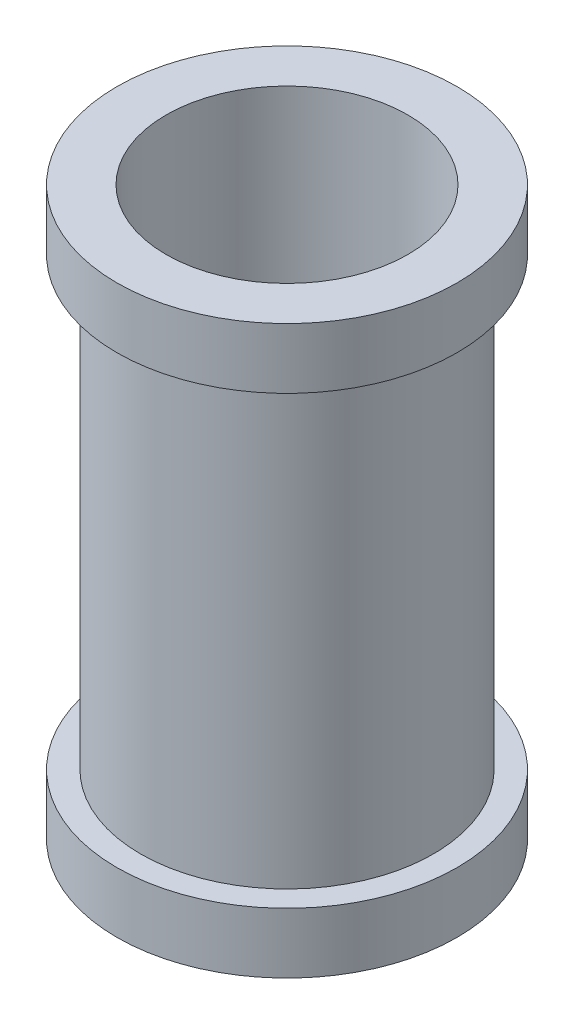
ISO-10303-21;
HEADER;
FILE_DESCRIPTION(('STEP AP214'),'2;1');
FILE_NAME('part.step','',(''),(''),'','','');
FILE_SCHEMA(('AUTOMOTIVE_DESIGN { 1 0 10303 214 1 1 1 1 }'));
ENDSEC;
DATA;
#1=APPLICATION_CONTEXT('core data for automotive mechanical design processes');
#2=APPLICATION_PROTOCOL_DEFINITION('international standard','automotive_design',2000,#1);
#3=PRODUCT_CONTEXT('',#1,'mechanical');
#4=PRODUCT('Part','Part','',(#3));
#5=PRODUCT_RELATED_PRODUCT_CATEGORY('part','',(#4));
#6=PRODUCT_DEFINITION_FORMATION('','',#4);
#7=PRODUCT_DEFINITION_CONTEXT('part definition',#1,'design');
#8=PRODUCT_DEFINITION('design','',#6,#7);
#9=PRODUCT_DEFINITION_SHAPE('','',#8);
#10=(LENGTH_UNIT() NAMED_UNIT(*) SI_UNIT(.MILLI.,.METRE.));
#11=(NAMED_UNIT(*) PLANE_ANGLE_UNIT() SI_UNIT($,.RADIAN.));
#12=(NAMED_UNIT(*) SI_UNIT($,.STERADIAN.) SOLID_ANGLE_UNIT());
#13=UNCERTAINTY_MEASURE_WITH_UNIT(LENGTH_MEASURE(1.E-05),#10,'distance_accuracy_value','');
#14=(GEOMETRIC_REPRESENTATION_CONTEXT(3) GLOBAL_UNCERTAINTY_ASSIGNED_CONTEXT((#13)) GLOBAL_UNIT_ASSIGNED_CONTEXT((#10,
#11,#12)) REPRESENTATION_CONTEXT('',''));
#15=CARTESIAN_POINT('',(0.,0.,0.));
#16=DIRECTION('',(0.,0.,1.));
#17=DIRECTION('',(1.,0.,0.));
#18=AXIS2_PLACEMENT_3D('',#15,#16,#17);
#19=CARTESIAN_POINT('',(-20.32,95.25,0.));
#20=DIRECTION('',(0.,1.,0.));
#21=DIRECTION('',(0.,0.,1.));
#22=AXIS2_PLACEMENT_3D('',#19,#20,#21);
#23=CYLINDRICAL_SURFACE('',#22,20.32);
#24=CARTESIAN_POINT('',(-20.32,0.,0.));
#25=DIRECTION('',(0.,1.,0.));
#26=DIRECTION('',(0.,0.,1.));
#27=AXIS2_PLACEMENT_3D('',#24,#25,#26);
#28=CIRCLE('',#27,20.32);
#29=CARTESIAN_POINT('',(-20.32,0.,20.32));
#30=VERTEX_POINT('',#29);
#31=EDGE_CURVE('E10',#30,#30,#28,.T.);
#32=ORIENTED_EDGE('',*,*,#31,.F.);
#33=EDGE_LOOP('',(#32));
#34=FACE_BOUND('',#33,.T.);
#35=CARTESIAN_POINT('',(-20.32,95.25,0.));
#36=DIRECTION('',(0.,1.,0.));
#37=DIRECTION('',(0.,0.,1.));
#38=AXIS2_PLACEMENT_3D('',#35,#36,#37);
#39=CIRCLE('',#38,20.32);
#40=CARTESIAN_POINT('',(-20.32,95.25,20.32));
#41=VERTEX_POINT('',#40);
#42=EDGE_CURVE('E62',#41,#41,#39,.T.);
#43=ORIENTED_EDGE('',*,*,#42,.T.);
#44=EDGE_LOOP('',(#43));
#45=FACE_BOUND('',#44,.T.);
#46=ADVANCED_FACE('F34',(#34,#45),#23,.F.);
#47=CARTESIAN_POINT('',(0.,0.,0.));
#48=DIRECTION('',(0.,1.,0.));
#49=DIRECTION('',(0.,0.,1.));
#50=AXIS2_PLACEMENT_3D('',#47,#48,#49);
#51=PLANE('',#50);
#52=CARTESIAN_POINT('',(-20.32,0.,0.));
#53=DIRECTION('',(0.,1.,0.));
#54=DIRECTION('',(0.,0.,1.));
#55=AXIS2_PLACEMENT_3D('',#52,#53,#54);
#56=CIRCLE('',#55,28.575);
#57=CARTESIAN_POINT('',(-20.32,0.,28.575));
#58=VERTEX_POINT('',#57);
#59=EDGE_CURVE('E40',#58,#58,#56,.T.);
#60=ORIENTED_EDGE('',*,*,#59,.F.);
#61=EDGE_LOOP('',(#60));
#62=FACE_BOUND('',#61,.T.);
#63=ORIENTED_EDGE('',*,*,#31,.T.);
#64=EDGE_LOOP('',(#63));
#65=FACE_BOUND('',#64,.T.);
#66=ADVANCED_FACE('F99',(#62,#65),#51,.F.);
#67=CARTESIAN_POINT('',(-20.32,95.25,0.));
#68=DIRECTION('',(0.,1.,0.));
#69=DIRECTION('',(0.,0.,1.));
#70=AXIS2_PLACEMENT_3D('',#67,#68,#69);
#71=CYLINDRICAL_SURFACE('',#70,28.575);
#72=CARTESIAN_POINT('',(-20.32,10.16,0.));
#73=DIRECTION('',(0.,1.,0.));
#74=DIRECTION('',(0.,0.,1.));
#75=AXIS2_PLACEMENT_3D('',#72,#73,#74);
#76=CIRCLE('',#75,28.575);
#77=CARTESIAN_POINT('',(-20.32,10.16,28.575));
#78=VERTEX_POINT('',#77);
#79=EDGE_CURVE('E44',#78,#78,#76,.T.);
#80=ORIENTED_EDGE('',*,*,#79,.F.);
#81=EDGE_LOOP('',(#80));
#82=FACE_BOUND('',#81,.T.);
#83=ORIENTED_EDGE('',*,*,#59,.T.);
#84=EDGE_LOOP('',(#83));
#85=FACE_BOUND('',#84,.T.);
#86=ADVANCED_FACE('F94',(#82,#85),#71,.T.);
#87=CARTESIAN_POINT('',(8.255,10.16,0.));
#88=DIRECTION('',(0.,-1.,0.));
#89=DIRECTION('',(0.,0.,-1.));
#90=AXIS2_PLACEMENT_3D('',#87,#88,#89);
#91=PLANE('',#90);
#92=CARTESIAN_POINT('',(-20.32,10.16,0.));
#93=DIRECTION('',(0.,1.,0.));
#94=DIRECTION('',(0.,0.,1.));
#95=AXIS2_PLACEMENT_3D('',#92,#93,#94);
#96=CIRCLE('',#95,24.60625);
#97=CARTESIAN_POINT('',(-20.32,10.16,24.60625));
#98=VERTEX_POINT('',#97);
#99=EDGE_CURVE('E48',#98,#98,#96,.T.);
#100=ORIENTED_EDGE('',*,*,#99,.F.);
#101=EDGE_LOOP('',(#100));
#102=FACE_BOUND('',#101,.T.);
#103=ORIENTED_EDGE('',*,*,#79,.T.);
#104=EDGE_LOOP('',(#103));
#105=FACE_BOUND('',#104,.T.);
#106=ADVANCED_FACE('F88',(#102,#105),#91,.F.);
#107=CARTESIAN_POINT('',(-20.32,95.25,0.));
#108=DIRECTION('',(0.,1.,0.));
#109=DIRECTION('',(0.,0.,1.));
#110=AXIS2_PLACEMENT_3D('',#107,#108,#109);
#111=CYLINDRICAL_SURFACE('',#110,24.60625);
#112=CARTESIAN_POINT('',(-20.32,85.09,0.));
#113=DIRECTION('',(0.,1.,0.));
#114=DIRECTION('',(0.,0.,1.));
#115=AXIS2_PLACEMENT_3D('',#112,#113,#114);
#116=CIRCLE('',#115,24.60625);
#117=CARTESIAN_POINT('',(-20.32,85.09,24.60625));
#118=VERTEX_POINT('',#117);
#119=EDGE_CURVE('E53',#118,#118,#116,.T.);
#120=ORIENTED_EDGE('',*,*,#119,.F.);
#121=EDGE_LOOP('',(#120));
#122=FACE_BOUND('',#121,.T.);
#123=ORIENTED_EDGE('',*,*,#99,.T.);
#124=EDGE_LOOP('',(#123));
#125=FACE_BOUND('',#124,.T.);
#126=ADVANCED_FACE('F82',(#122,#125),#111,.T.);
#127=CARTESIAN_POINT('',(8.25499999999999,85.09,0.));
#128=DIRECTION('',(0.,1.,0.));
#129=DIRECTION('',(0.,0.,1.));
#130=AXIS2_PLACEMENT_3D('',#127,#128,#129);
#131=PLANE('',#130);
#132=CARTESIAN_POINT('',(-20.32,85.09,0.));
#133=DIRECTION('',(0.,1.,0.));
#134=DIRECTION('',(0.,0.,1.));
#135=AXIS2_PLACEMENT_3D('',#132,#133,#134);
#136=CIRCLE('',#135,28.575);
#137=CARTESIAN_POINT('',(-20.32,85.09,28.575));
#138=VERTEX_POINT('',#137);
#139=EDGE_CURVE('E56',#138,#138,#136,.T.);
#140=ORIENTED_EDGE('',*,*,#139,.F.);
#141=EDGE_LOOP('',(#140));
#142=FACE_BOUND('',#141,.T.);
#143=ORIENTED_EDGE('',*,*,#119,.T.);
#144=EDGE_LOOP('',(#143));
#145=FACE_BOUND('',#144,.T.);
#146=ADVANCED_FACE('F76',(#142,#145),#131,.F.);
#147=CARTESIAN_POINT('',(-20.32,95.25,0.));
#148=DIRECTION('',(0.,1.,0.));
#149=DIRECTION('',(0.,0.,1.));
#150=AXIS2_PLACEMENT_3D('',#147,#148,#149);
#151=CYLINDRICAL_SURFACE('',#150,28.575);
#152=CARTESIAN_POINT('',(-20.32,95.25,0.));
#153=DIRECTION('',(0.,1.,0.));
#154=DIRECTION('',(0.,0.,1.));
#155=AXIS2_PLACEMENT_3D('',#152,#153,#154);
#156=CIRCLE('',#155,28.575);
#157=CARTESIAN_POINT('',(-20.32,95.25,28.575));
#158=VERTEX_POINT('',#157);
#159=EDGE_CURVE('E59',#158,#158,#156,.T.);
#160=ORIENTED_EDGE('',*,*,#159,.F.);
#161=EDGE_LOOP('',(#160));
#162=FACE_BOUND('',#161,.T.);
#163=ORIENTED_EDGE('',*,*,#139,.T.);
#164=EDGE_LOOP('',(#163));
#165=FACE_BOUND('',#164,.T.);
#166=ADVANCED_FACE('F70',(#162,#165),#151,.T.);
#167=CARTESIAN_POINT('',(8.25499999999999,95.25,0.));
#168=DIRECTION('',(0.,-1.,0.));
#169=DIRECTION('',(0.,0.,-1.));
#170=AXIS2_PLACEMENT_3D('',#167,#168,#169);
#171=PLANE('',#170);
#172=ORIENTED_EDGE('',*,*,#42,.F.);
#173=EDGE_LOOP('',(#172));
#174=FACE_BOUND('',#173,.T.);
#175=ORIENTED_EDGE('',*,*,#159,.T.);
#176=EDGE_LOOP('',(#175));
#177=FACE_BOUND('',#176,.T.);
#178=ADVANCED_FACE('F67',(#174,#177),#171,.F.);
#179=CLOSED_SHELL('',(#46,#66,#86,#106,#126,#146,#166,#178));
#180=MANIFOLD_SOLID_BREP('B2',#179);
#181=ADVANCED_BREP_SHAPE_REPRESENTATION('',(#18,#180),#14);
#182=SHAPE_DEFINITION_REPRESENTATION(#9,#181);
ENDSEC;
END-ISO-10303-21;
